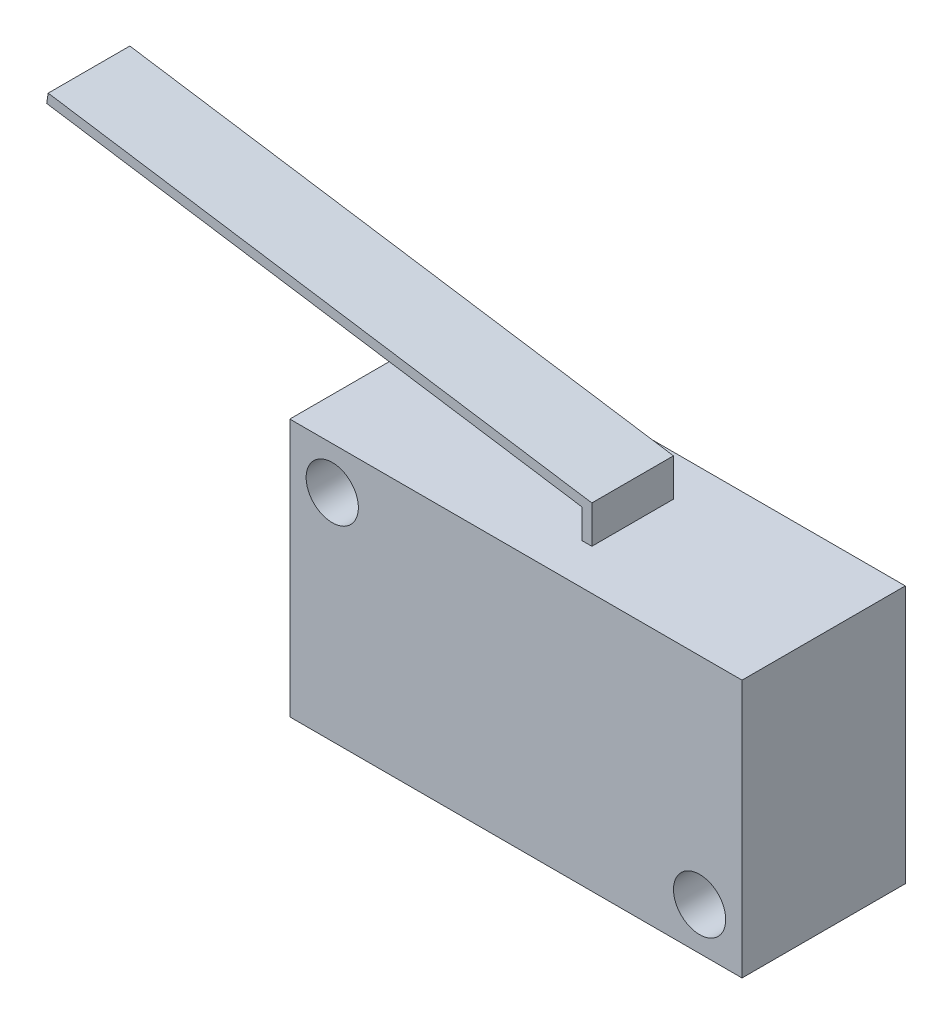
ISO-10303-21;
HEADER;
FILE_DESCRIPTION(('STEP AP214'),'2;1');
FILE_NAME('part.step','',(''),(''),'','','');
FILE_SCHEMA(('AUTOMOTIVE_DESIGN { 1 0 10303 214 1 1 1 1 }'));
ENDSEC;
DATA;
#1=APPLICATION_CONTEXT('core data for automotive mechanical design processes');
#2=APPLICATION_PROTOCOL_DEFINITION('international standard','automotive_design',2000,#1);
#3=PRODUCT_CONTEXT('',#1,'mechanical');
#4=PRODUCT('Part','Part','',(#3));
#5=PRODUCT_RELATED_PRODUCT_CATEGORY('part','',(#4));
#6=PRODUCT_DEFINITION_FORMATION('','',#4);
#7=PRODUCT_DEFINITION_CONTEXT('part definition',#1,'design');
#8=PRODUCT_DEFINITION('design','',#6,#7);
#9=PRODUCT_DEFINITION_SHAPE('','',#8);
#10=(LENGTH_UNIT() NAMED_UNIT(*) SI_UNIT(.MILLI.,.METRE.));
#11=(NAMED_UNIT(*) PLANE_ANGLE_UNIT() SI_UNIT($,.RADIAN.));
#12=(NAMED_UNIT(*) SI_UNIT($,.STERADIAN.) SOLID_ANGLE_UNIT());
#13=UNCERTAINTY_MEASURE_WITH_UNIT(LENGTH_MEASURE(1.E-05),#10,'distance_accuracy_value','');
#14=(GEOMETRIC_REPRESENTATION_CONTEXT(3) GLOBAL_UNCERTAINTY_ASSIGNED_CONTEXT((#13)) GLOBAL_UNIT_ASSIGNED_CONTEXT((#10,
#11,#12)) REPRESENTATION_CONTEXT('',''));
#15=CARTESIAN_POINT('',(0.,0.,0.));
#16=DIRECTION('',(0.,0.,1.));
#17=DIRECTION('',(1.,0.,0.));
#18=AXIS2_PLACEMENT_3D('',#15,#16,#17);
#19=CARTESIAN_POINT('',(13.85,7.9,5.));
#20=DIRECTION('',(0.,-1.,0.));
#21=DIRECTION('',(1.,0.,0.));
#22=AXIS2_PLACEMENT_3D('',#19,#20,#21);
#23=PLANE('',#22);
#24=DIRECTION('',(-1.,0.,0.));
#25=VECTOR('',#24,1.);
#26=CARTESIAN_POINT('',(13.85,7.9,-5.));
#27=LINE('',#26,#25);
#28=CARTESIAN_POINT('',(13.85,7.9,-5.));
#29=VERTEX_POINT('',#28);
#30=CARTESIAN_POINT('',(-13.85,7.90000000000001,-5.));
#31=VERTEX_POINT('',#30);
#32=EDGE_CURVE('E85',#29,#31,#27,.T.);
#33=ORIENTED_EDGE('',*,*,#32,.T.);
#34=DIRECTION('',(0.,0.,-1.));
#35=VECTOR('',#34,1.);
#36=CARTESIAN_POINT('',(-13.85,7.90000000000001,5.));
#37=LINE('',#36,#35);
#38=CARTESIAN_POINT('',(-13.85,7.90000000000001,5.));
#39=VERTEX_POINT('',#38);
#40=EDGE_CURVE('E228',#39,#31,#37,.T.);
#41=ORIENTED_EDGE('',*,*,#40,.F.);
#42=DIRECTION('',(-1.,0.,0.));
#43=VECTOR('',#42,1.);
#44=CARTESIAN_POINT('',(13.85,7.9,5.));
#45=LINE('',#44,#43);
#46=CARTESIAN_POINT('',(13.85,7.9,5.));
#47=VERTEX_POINT('',#46);
#48=EDGE_CURVE('E64',#47,#39,#45,.T.);
#49=ORIENTED_EDGE('',*,*,#48,.F.);
#50=DIRECTION('',(0.,0.,-1.));
#51=VECTOR('',#50,1.);
#52=CARTESIAN_POINT('',(13.85,7.9,5.));
#53=LINE('',#52,#51);
#54=EDGE_CURVE('E242',#47,#29,#53,.T.);
#55=ORIENTED_EDGE('',*,*,#54,.T.);
#56=EDGE_LOOP('',(#33,#41,#49,#55));
#57=FACE_BOUND('',#56,.T.);
#58=DIRECTION('',(-1.,0.,0.));
#59=VECTOR('',#58,1.);
#60=CARTESIAN_POINT('',(2.14999999999999,7.9,2.5));
#61=LINE('',#60,#59);
#62=CARTESIAN_POINT('',(2.14999999999999,7.9,2.5));
#63=VERTEX_POINT('',#62);
#64=CARTESIAN_POINT('',(1.54999999999999,7.9,2.5));
#65=VERTEX_POINT('',#64);
#66=EDGE_CURVE('E163',#63,#65,#61,.T.);
#67=ORIENTED_EDGE('',*,*,#66,.T.);
#68=DIRECTION('',(0.,0.,-1.));
#69=VECTOR('',#68,1.);
#70=CARTESIAN_POINT('',(1.54999999999999,7.9,2.5));
#71=LINE('',#70,#69);
#72=CARTESIAN_POINT('',(1.54999999999999,7.9,-2.5));
#73=VERTEX_POINT('',#72);
#74=EDGE_CURVE('E193',#65,#73,#71,.T.);
#75=ORIENTED_EDGE('',*,*,#74,.T.);
#76=DIRECTION('',(-1.,0.,0.));
#77=VECTOR('',#76,1.);
#78=CARTESIAN_POINT('',(2.14999999999999,7.9,-2.5));
#79=LINE('',#78,#77);
#80=CARTESIAN_POINT('',(2.14999999999999,7.90000000000001,-2.5));
#81=VERTEX_POINT('',#80);
#82=EDGE_CURVE('E183',#81,#73,#79,.T.);
#83=ORIENTED_EDGE('',*,*,#82,.F.);
#84=DIRECTION('',(0.,0.,-1.));
#85=VECTOR('',#84,1.);
#86=CARTESIAN_POINT('',(2.14999999999999,7.9,2.5));
#87=LINE('',#86,#85);
#88=EDGE_CURVE('E190',#63,#81,#87,.T.);
#89=ORIENTED_EDGE('',*,*,#88,.F.);
#90=EDGE_LOOP('',(#67,#75,#83,#89));
#91=FACE_BOUND('',#90,.T.);
#92=ADVANCED_FACE('F39',(#57,#91),#23,.F.);
#93=CARTESIAN_POINT('',(-13.85,7.90000000000001,5.));
#94=DIRECTION('',(0.,0.,1.));
#95=DIRECTION('',(1.,0.,0.));
#96=AXIS2_PLACEMENT_3D('',#93,#94,#95);
#97=PLANE('',#96);
#98=CARTESIAN_POINT('',(-11.25,5.30000000000001,5.));
#99=DIRECTION('',(0.,0.,1.));
#100=DIRECTION('',(1.,0.,0.));
#101=AXIS2_PLACEMENT_3D('',#98,#99,#100);
#102=CIRCLE('',#101,1.6);
#103=CARTESIAN_POINT('',(-9.65000000000002,5.30000000000001,5.));
#104=VERTEX_POINT('',#103);
#105=EDGE_CURVE('E210',#104,#104,#102,.T.);
#106=ORIENTED_EDGE('',*,*,#105,.F.);
#107=EDGE_LOOP('',(#106));
#108=FACE_BOUND('',#107,.T.);
#109=DIRECTION('',(0.,-1.,0.));
#110=VECTOR('',#109,1.);
#111=CARTESIAN_POINT('',(-13.85,-7.89999999999999,5.));
#112=LINE('',#111,#110);
#113=CARTESIAN_POINT('',(-13.85,-7.89999999999999,5.));
#114=VERTEX_POINT('',#113);
#115=EDGE_CURVE('E218',#39,#114,#112,.T.);
#116=ORIENTED_EDGE('',*,*,#115,.T.);
#117=DIRECTION('',(1.,0.,0.));
#118=VECTOR('',#117,1.);
#119=CARTESIAN_POINT('',(13.85,-7.89999999999999,5.));
#120=LINE('',#119,#118);
#121=CARTESIAN_POINT('',(13.85,-7.89999999999999,5.));
#122=VERTEX_POINT('',#121);
#123=EDGE_CURVE('E92',#114,#122,#120,.T.);
#124=ORIENTED_EDGE('',*,*,#123,.T.);
#125=DIRECTION('',(0.,1.,0.));
#126=VECTOR('',#125,1.);
#127=CARTESIAN_POINT('',(13.85,-7.89999999999999,5.));
#128=LINE('',#127,#126);
#129=EDGE_CURVE('E223',#122,#47,#128,.T.);
#130=ORIENTED_EDGE('',*,*,#129,.T.);
#131=ORIENTED_EDGE('',*,*,#48,.T.);
#132=EDGE_LOOP('',(#116,#124,#130,#131));
#133=FACE_BOUND('',#132,.T.);
#134=CARTESIAN_POINT('',(11.25,-5.29999999999999,5.));
#135=DIRECTION('',(0.,0.,1.));
#136=DIRECTION('',(1.,0.,0.));
#137=AXIS2_PLACEMENT_3D('',#134,#135,#136);
#138=CIRCLE('',#137,1.6);
#139=CARTESIAN_POINT('',(12.85,-5.29999999999999,5.));
#140=VERTEX_POINT('',#139);
#141=EDGE_CURVE('E202',#140,#140,#138,.T.);
#142=ORIENTED_EDGE('',*,*,#141,.F.);
#143=EDGE_LOOP('',(#142));
#144=FACE_BOUND('',#143,.T.);
#145=ADVANCED_FACE('F260',(#108,#133,#144),#97,.T.);
#146=CARTESIAN_POINT('',(-13.85,7.90000000000001,-5.));
#147=DIRECTION('',(0.,0.,1.));
#148=DIRECTION('',(1.,0.,0.));
#149=AXIS2_PLACEMENT_3D('',#146,#147,#148);
#150=PLANE('',#149);
#151=CARTESIAN_POINT('',(-11.25,5.30000000000001,-5.));
#152=DIRECTION('',(0.,0.,1.));
#153=DIRECTION('',(1.,0.,0.));
#154=AXIS2_PLACEMENT_3D('',#151,#152,#153);
#155=CIRCLE('',#154,1.6);
#156=CARTESIAN_POINT('',(-9.65000000000002,5.30000000000001,-5.));
#157=VERTEX_POINT('',#156);
#158=EDGE_CURVE('E206',#157,#157,#155,.T.);
#159=ORIENTED_EDGE('',*,*,#158,.T.);
#160=EDGE_LOOP('',(#159));
#161=FACE_BOUND('',#160,.T.);
#162=DIRECTION('',(0.,-1.,0.));
#163=VECTOR('',#162,1.);
#164=CARTESIAN_POINT('',(-13.85,-7.89999999999999,-5.));
#165=LINE('',#164,#163);
#166=CARTESIAN_POINT('',(-13.85,-7.89999999999999,-5.));
#167=VERTEX_POINT('',#166);
#168=EDGE_CURVE('E214',#31,#167,#165,.T.);
#169=ORIENTED_EDGE('',*,*,#168,.F.);
#170=ORIENTED_EDGE('',*,*,#32,.F.);
#171=DIRECTION('',(0.,1.,0.));
#172=VECTOR('',#171,1.);
#173=CARTESIAN_POINT('',(13.85,-7.89999999999999,-5.));
#174=LINE('',#173,#172);
#175=CARTESIAN_POINT('',(13.85,-7.89999999999999,-5.));
#176=VERTEX_POINT('',#175);
#177=EDGE_CURVE('E235',#176,#29,#174,.T.);
#178=ORIENTED_EDGE('',*,*,#177,.F.);
#179=DIRECTION('',(1.,0.,0.));
#180=VECTOR('',#179,1.);
#181=CARTESIAN_POINT('',(13.85,-7.89999999999999,-5.));
#182=LINE('',#181,#180);
#183=EDGE_CURVE('E232',#167,#176,#182,.T.);
#184=ORIENTED_EDGE('',*,*,#183,.F.);
#185=EDGE_LOOP('',(#169,#170,#178,#184));
#186=FACE_BOUND('',#185,.T.);
#187=CARTESIAN_POINT('',(11.25,-5.29999999999999,-5.));
#188=DIRECTION('',(0.,0.,1.));
#189=DIRECTION('',(1.,0.,0.));
#190=AXIS2_PLACEMENT_3D('',#187,#188,#189);
#191=CIRCLE('',#190,1.6);
#192=CARTESIAN_POINT('',(12.85,-5.29999999999999,-5.));
#193=VERTEX_POINT('',#192);
#194=EDGE_CURVE('E149',#193,#193,#191,.T.);
#195=ORIENTED_EDGE('',*,*,#194,.T.);
#196=EDGE_LOOP('',(#195));
#197=FACE_BOUND('',#196,.T.);
#198=ADVANCED_FACE('F253',(#161,#186,#197),#150,.F.);
#199=CARTESIAN_POINT('',(-13.85,-7.89999999999999,5.));
#200=DIRECTION('',(1.,0.,0.));
#201=DIRECTION('',(0.,0.,-1.));
#202=AXIS2_PLACEMENT_3D('',#199,#200,#201);
#203=PLANE('',#202);
#204=ORIENTED_EDGE('',*,*,#168,.T.);
#205=DIRECTION('',(0.,0.,-1.));
#206=VECTOR('',#205,1.);
#207=CARTESIAN_POINT('',(-13.85,-7.89999999999999,5.));
#208=LINE('',#207,#206);
#209=EDGE_CURVE('E11',#114,#167,#208,.T.);
#210=ORIENTED_EDGE('',*,*,#209,.F.);
#211=ORIENTED_EDGE('',*,*,#115,.F.);
#212=ORIENTED_EDGE('',*,*,#40,.T.);
#213=EDGE_LOOP('',(#204,#210,#211,#212));
#214=FACE_BOUND('',#213,.T.);
#215=ADVANCED_FACE('F41',(#214),#203,.F.);
#216=CARTESIAN_POINT('',(13.85,-7.89999999999999,5.));
#217=DIRECTION('',(0.,1.,0.));
#218=DIRECTION('',(0.,0.,1.));
#219=AXIS2_PLACEMENT_3D('',#216,#217,#218);
#220=PLANE('',#219);
#221=ORIENTED_EDGE('',*,*,#183,.T.);
#222=DIRECTION('',(0.,0.,-1.));
#223=VECTOR('',#222,1.);
#224=CARTESIAN_POINT('',(13.85,-7.89999999999999,5.));
#225=LINE('',#224,#223);
#226=EDGE_CURVE('E48',#122,#176,#225,.T.);
#227=ORIENTED_EDGE('',*,*,#226,.F.);
#228=ORIENTED_EDGE('',*,*,#123,.F.);
#229=ORIENTED_EDGE('',*,*,#209,.T.);
#230=EDGE_LOOP('',(#221,#227,#228,#229));
#231=FACE_BOUND('',#230,.T.);
#232=ADVANCED_FACE('F305',(#231),#220,.F.);
#233=CARTESIAN_POINT('',(13.85,-7.89999999999999,5.));
#234=DIRECTION('',(-1.,0.,0.));
#235=DIRECTION('',(0.,0.,1.));
#236=AXIS2_PLACEMENT_3D('',#233,#234,#235);
#237=PLANE('',#236);
#238=ORIENTED_EDGE('',*,*,#177,.T.);
#239=ORIENTED_EDGE('',*,*,#54,.F.);
#240=ORIENTED_EDGE('',*,*,#129,.F.);
#241=ORIENTED_EDGE('',*,*,#226,.T.);
#242=EDGE_LOOP('',(#238,#239,#240,#241));
#243=FACE_BOUND('',#242,.T.);
#244=ADVANCED_FACE('F249',(#243),#237,.F.);
#245=CARTESIAN_POINT('',(-11.25,5.30000000000001,5.));
#246=DIRECTION('',(0.,0.,-1.));
#247=DIRECTION('',(-1.,0.,0.));
#248=AXIS2_PLACEMENT_3D('',#245,#246,#247);
#249=CYLINDRICAL_SURFACE('',#248,1.6);
#250=ORIENTED_EDGE('',*,*,#105,.T.);
#251=EDGE_LOOP('',(#250));
#252=FACE_BOUND('',#251,.T.);
#253=ORIENTED_EDGE('',*,*,#158,.F.);
#254=EDGE_LOOP('',(#253));
#255=FACE_BOUND('',#254,.T.);
#256=ADVANCED_FACE('F293',(#252,#255),#249,.F.);
#257=CARTESIAN_POINT('',(11.25,-5.29999999999999,5.));
#258=DIRECTION('',(0.,0.,-1.));
#259=DIRECTION('',(-1.,0.,0.));
#260=AXIS2_PLACEMENT_3D('',#257,#258,#259);
#261=CYLINDRICAL_SURFACE('',#260,1.6);
#262=ORIENTED_EDGE('',*,*,#141,.T.);
#263=EDGE_LOOP('',(#262));
#264=FACE_BOUND('',#263,.T.);
#265=ORIENTED_EDGE('',*,*,#194,.F.);
#266=EDGE_LOOP('',(#265));
#267=FACE_BOUND('',#266,.T.);
#268=ADVANCED_FACE('F290',(#264,#267),#261,.F.);
#269=CARTESIAN_POINT('',(2.14999999999999,10.2,2.5));
#270=DIRECTION('',(-0.151060036545824,-0.988524590163934,0.));
#271=DIRECTION('',(0.988524590163934,-0.151060036545824,0.));
#272=AXIS2_PLACEMENT_3D('',#269,#270,#271);
#273=PLANE('',#272);
#274=DIRECTION('',(-0.988524590163934,0.151060036545824,0.));
#275=VECTOR('',#274,1.);
#276=CARTESIAN_POINT('',(2.14999999999999,10.2,-2.5));
#277=LINE('',#276,#275);
#278=CARTESIAN_POINT('',(2.14999999999999,10.2,-2.5));
#279=VERTEX_POINT('',#278);
#280=CARTESIAN_POINT('',(-31.15,15.2886940669243,-2.5));
#281=VERTEX_POINT('',#280);
#282=EDGE_CURVE('E144',#279,#281,#277,.T.);
#283=ORIENTED_EDGE('',*,*,#282,.T.);
#284=DIRECTION('',(0.,0.,-1.));
#285=VECTOR('',#284,1.);
#286=CARTESIAN_POINT('',(-31.15,15.2886940669243,2.5));
#287=LINE('',#286,#285);
#288=CARTESIAN_POINT('',(-31.15,15.2886940669243,2.5));
#289=VERTEX_POINT('',#288);
#290=EDGE_CURVE('E142',#289,#281,#287,.T.);
#291=ORIENTED_EDGE('',*,*,#290,.F.);
#292=DIRECTION('',(-0.988524590163934,0.151060036545824,0.));
#293=VECTOR('',#292,1.);
#294=CARTESIAN_POINT('',(2.14999999999999,10.2,2.5));
#295=LINE('',#294,#293);
#296=CARTESIAN_POINT('',(2.14999999999999,10.2,2.5));
#297=VERTEX_POINT('',#296);
#298=EDGE_CURVE('E127',#297,#289,#295,.T.);
#299=ORIENTED_EDGE('',*,*,#298,.F.);
#300=DIRECTION('',(0.,0.,-1.));
#301=VECTOR('',#300,1.);
#302=CARTESIAN_POINT('',(2.14999999999999,10.2,2.5));
#303=LINE('',#302,#301);
#304=EDGE_CURVE('E169',#297,#279,#303,.T.);
#305=ORIENTED_EDGE('',*,*,#304,.T.);
#306=EDGE_LOOP('',(#283,#291,#299,#305));
#307=FACE_BOUND('',#306,.T.);
#308=ADVANCED_FACE('F143',(#307),#273,.F.);
#309=CARTESIAN_POINT('',(-31.2406360219275,14.6955793128259,2.5));
#310=DIRECTION('',(-0.988524590163932,0.151060036545839,0.));
#311=DIRECTION('',(-0.151060036545839,-0.988524590163932,0.));
#312=AXIS2_PLACEMENT_3D('',#309,#310,#311);
#313=PLANE('',#312);
#314=DIRECTION('',(0.151060036545839,0.988524590163932,0.));
#315=VECTOR('',#314,1.);
#316=CARTESIAN_POINT('',(-31.2406360219275,14.6955793128259,-2.5));
#317=LINE('',#316,#315);
#318=CARTESIAN_POINT('',(-31.2406360219275,14.6955793128259,-2.5));
#319=VERTEX_POINT('',#318);
#320=EDGE_CURVE('E172',#319,#281,#317,.T.);
#321=ORIENTED_EDGE('',*,*,#320,.F.);
#322=DIRECTION('',(0.,0.,-1.));
#323=VECTOR('',#322,1.);
#324=CARTESIAN_POINT('',(-31.2406360219275,14.6955793128259,2.5));
#325=LINE('',#324,#323);
#326=CARTESIAN_POINT('',(-31.2406360219275,14.6955793128259,2.5));
#327=VERTEX_POINT('',#326);
#328=EDGE_CURVE('E150',#327,#319,#325,.T.);
#329=ORIENTED_EDGE('',*,*,#328,.F.);
#330=DIRECTION('',(0.151060036545839,0.988524590163932,0.));
#331=VECTOR('',#330,1.);
#332=CARTESIAN_POINT('',(-31.2406360219275,14.6955793128259,2.5));
#333=LINE('',#332,#331);
#334=EDGE_CURVE('E132',#327,#289,#333,.T.);
#335=ORIENTED_EDGE('',*,*,#334,.T.);
#336=ORIENTED_EDGE('',*,*,#290,.T.);
#337=EDGE_LOOP('',(#321,#329,#335,#336));
#338=FACE_BOUND('',#337,.T.);
#339=ADVANCED_FACE('F152',(#338),#313,.T.);
#340=CARTESIAN_POINT('',(2.05936397807249,9.60688524590164,2.5));
#341=DIRECTION('',(-0.151060036545824,-0.988524590163934,0.));
#342=DIRECTION('',(0.988524590163934,-0.151060036545824,0.));
#343=AXIS2_PLACEMENT_3D('',#340,#341,#342);
#344=PLANE('',#343);
#345=DIRECTION('',(-0.988524590163934,0.151060036545824,0.));
#346=VECTOR('',#345,1.);
#347=CARTESIAN_POINT('',(2.05936397807249,9.60688524590164,-2.5));
#348=LINE('',#347,#346);
#349=CARTESIAN_POINT('',(1.54999999999999,9.68472300725667,-2.5));
#350=VERTEX_POINT('',#349);
#351=EDGE_CURVE('E175',#350,#319,#348,.T.);
#352=ORIENTED_EDGE('',*,*,#351,.F.);
#353=DIRECTION('',(0.,0.,-1.));
#354=VECTOR('',#353,1.);
#355=CARTESIAN_POINT('',(1.54999999999999,9.68472300725667,2.5));
#356=LINE('',#355,#354);
#357=CARTESIAN_POINT('',(1.54999999999999,9.68472300725667,2.5));
#358=VERTEX_POINT('',#357);
#359=EDGE_CURVE('E197',#358,#350,#356,.T.);
#360=ORIENTED_EDGE('',*,*,#359,.F.);
#361=DIRECTION('',(-0.988524590163934,0.151060036545824,0.));
#362=VECTOR('',#361,1.);
#363=CARTESIAN_POINT('',(2.05936397807249,9.60688524590164,2.5));
#364=LINE('',#363,#362);
#365=EDGE_CURVE('E154',#358,#327,#364,.T.);
#366=ORIENTED_EDGE('',*,*,#365,.T.);
#367=ORIENTED_EDGE('',*,*,#328,.T.);
#368=EDGE_LOOP('',(#352,#360,#366,#367));
#369=FACE_BOUND('',#368,.T.);
#370=ADVANCED_FACE('F282',(#369),#344,.T.);
#371=CARTESIAN_POINT('',(1.54999999999999,7.9,2.5));
#372=DIRECTION('',(-1.,0.,0.));
#373=DIRECTION('',(0.,0.,1.));
#374=AXIS2_PLACEMENT_3D('',#371,#372,#373);
#375=PLANE('',#374);
#376=DIRECTION('',(0.,1.,0.));
#377=VECTOR('',#376,1.);
#378=CARTESIAN_POINT('',(1.54999999999999,7.9,-2.5));
#379=LINE('',#378,#377);
#380=EDGE_CURVE('E179',#73,#350,#379,.T.);
#381=ORIENTED_EDGE('',*,*,#380,.F.);
#382=ORIENTED_EDGE('',*,*,#74,.F.);
#383=DIRECTION('',(0.,1.,0.));
#384=VECTOR('',#383,1.);
#385=CARTESIAN_POINT('',(1.54999999999999,7.9,2.5));
#386=LINE('',#385,#384);
#387=EDGE_CURVE('E157',#65,#358,#386,.T.);
#388=ORIENTED_EDGE('',*,*,#387,.T.);
#389=ORIENTED_EDGE('',*,*,#359,.T.);
#390=EDGE_LOOP('',(#381,#382,#388,#389));
#391=FACE_BOUND('',#390,.T.);
#392=ADVANCED_FACE('F266',(#391),#375,.T.);
#393=CARTESIAN_POINT('',(2.14999999999999,7.9,2.5));
#394=DIRECTION('',(-1.,0.,0.));
#395=DIRECTION('',(0.,0.,1.));
#396=AXIS2_PLACEMENT_3D('',#393,#394,#395);
#397=PLANE('',#396);
#398=DIRECTION('',(0.,1.,0.));
#399=VECTOR('',#398,1.);
#400=CARTESIAN_POINT('',(2.14999999999999,7.9,-2.5));
#401=LINE('',#400,#399);
#402=EDGE_CURVE('E55',#81,#279,#401,.T.);
#403=ORIENTED_EDGE('',*,*,#402,.T.);
#404=ORIENTED_EDGE('',*,*,#304,.F.);
#405=DIRECTION('',(0.,1.,0.));
#406=VECTOR('',#405,1.);
#407=CARTESIAN_POINT('',(2.14999999999999,7.9,2.5));
#408=LINE('',#407,#406);
#409=EDGE_CURVE('E135',#63,#297,#408,.T.);
#410=ORIENTED_EDGE('',*,*,#409,.F.);
#411=ORIENTED_EDGE('',*,*,#88,.T.);
#412=EDGE_LOOP('',(#403,#404,#410,#411));
#413=FACE_BOUND('',#412,.T.);
#414=ADVANCED_FACE('F274',(#413),#397,.F.);
#415=CARTESIAN_POINT('',(-31.15,15.2886940669243,2.5));
#416=DIRECTION('',(0.,0.,-1.));
#417=DIRECTION('',(-1.,0.,0.));
#418=AXIS2_PLACEMENT_3D('',#415,#416,#417);
#419=PLANE('',#418);
#420=ORIENTED_EDGE('',*,*,#298,.T.);
#421=ORIENTED_EDGE('',*,*,#334,.F.);
#422=ORIENTED_EDGE('',*,*,#365,.F.);
#423=ORIENTED_EDGE('',*,*,#387,.F.);
#424=ORIENTED_EDGE('',*,*,#66,.F.);
#425=ORIENTED_EDGE('',*,*,#409,.T.);
#426=EDGE_LOOP('',(#420,#421,#422,#423,#424,#425));
#427=FACE_BOUND('',#426,.T.);
#428=ADVANCED_FACE('F129',(#427),#419,.F.);
#429=CARTESIAN_POINT('',(-31.15,15.2886940669243,-2.5));
#430=DIRECTION('',(0.,0.,-1.));
#431=DIRECTION('',(-1.,0.,0.));
#432=AXIS2_PLACEMENT_3D('',#429,#430,#431);
#433=PLANE('',#432);
#434=ORIENTED_EDGE('',*,*,#282,.F.);
#435=ORIENTED_EDGE('',*,*,#402,.F.);
#436=ORIENTED_EDGE('',*,*,#82,.T.);
#437=ORIENTED_EDGE('',*,*,#380,.T.);
#438=ORIENTED_EDGE('',*,*,#351,.T.);
#439=ORIENTED_EDGE('',*,*,#320,.T.);
#440=EDGE_LOOP('',(#434,#435,#436,#437,#438,#439));
#441=FACE_BOUND('',#440,.T.);
#442=ADVANCED_FACE('F268',(#441),#433,.T.);
#443=CLOSED_SHELL('',(#92,#145,#198,#215,#232,#244,#256,#268,#308,#339,#370,#392,#414,#428,#442));
#444=MANIFOLD_SOLID_BREP('B2',#443);
#445=ADVANCED_BREP_SHAPE_REPRESENTATION('',(#18,#444),#14);
#446=SHAPE_DEFINITION_REPRESENTATION(#9,#445);
ENDSEC;
END-ISO-10303-21;
